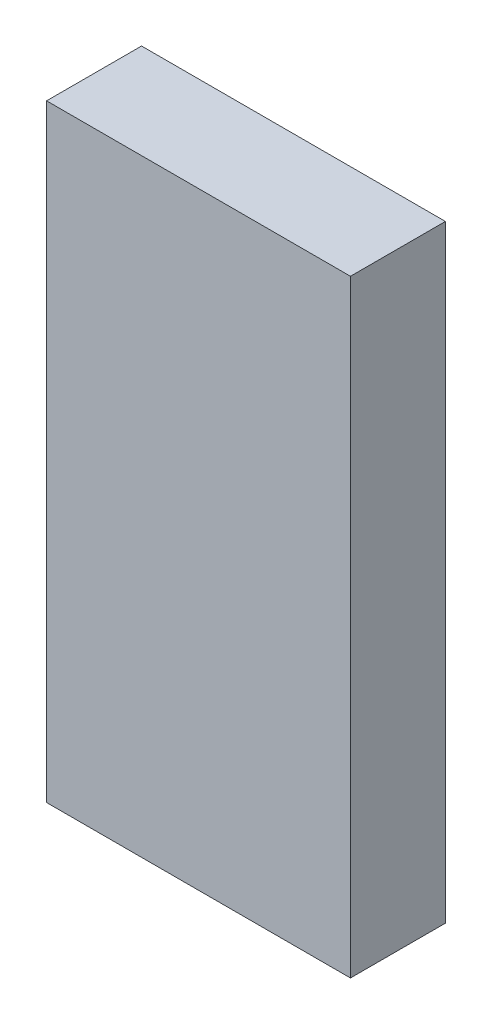
ISO-10303-21;
HEADER;
FILE_DESCRIPTION(('STEP AP214'),'2;1');
FILE_NAME('part.step','',(''),(''),'','','');
FILE_SCHEMA(('AUTOMOTIVE_DESIGN { 1 0 10303 214 1 1 1 1 }'));
ENDSEC;
DATA;
#1=APPLICATION_CONTEXT('core data for automotive mechanical design processes');
#2=APPLICATION_PROTOCOL_DEFINITION('international standard','automotive_design',2000,#1);
#3=PRODUCT_CONTEXT('',#1,'mechanical');
#4=PRODUCT('Part','Part','',(#3));
#5=PRODUCT_RELATED_PRODUCT_CATEGORY('part','',(#4));
#6=PRODUCT_DEFINITION_FORMATION('','',#4);
#7=PRODUCT_DEFINITION_CONTEXT('part definition',#1,'design');
#8=PRODUCT_DEFINITION('design','',#6,#7);
#9=PRODUCT_DEFINITION_SHAPE('','',#8);
#10=(LENGTH_UNIT() NAMED_UNIT(*) SI_UNIT(.MILLI.,.METRE.));
#11=(NAMED_UNIT(*) PLANE_ANGLE_UNIT() SI_UNIT($,.RADIAN.));
#12=(NAMED_UNIT(*) SI_UNIT($,.STERADIAN.) SOLID_ANGLE_UNIT());
#13=UNCERTAINTY_MEASURE_WITH_UNIT(LENGTH_MEASURE(1.E-05),#10,'distance_accuracy_value','');
#14=(GEOMETRIC_REPRESENTATION_CONTEXT(3) GLOBAL_UNCERTAINTY_ASSIGNED_CONTEXT((#13)) GLOBAL_UNIT_ASSIGNED_CONTEXT((#10,
#11,#12)) REPRESENTATION_CONTEXT('',''));
#15=CARTESIAN_POINT('',(0.,0.,0.));
#16=DIRECTION('',(0.,0.,1.));
#17=DIRECTION('',(1.,0.,0.));
#18=AXIS2_PLACEMENT_3D('',#15,#16,#17);
#19=CARTESIAN_POINT('',(0.,0.,31.75));
#20=DIRECTION('',(1.,0.,0.));
#21=DIRECTION('',(0.,0.,-1.));
#22=AXIS2_PLACEMENT_3D('',#19,#20,#21);
#23=PLANE('',#22);
#24=DIRECTION('',(0.,-1.,0.));
#25=VECTOR('',#24,1.);
#26=CARTESIAN_POINT('',(0.,0.,0.));
#27=LINE('',#26,#25);
#28=CARTESIAN_POINT('',(0.,203.2,0.));
#29=VERTEX_POINT('',#28);
#30=CARTESIAN_POINT('',(0.,0.,0.));
#31=VERTEX_POINT('',#30);
#32=EDGE_CURVE('E95',#29,#31,#27,.T.);
#33=ORIENTED_EDGE('',*,*,#32,.T.);
#34=DIRECTION('',(0.,0.,-1.));
#35=VECTOR('',#34,1.);
#36=CARTESIAN_POINT('',(0.,0.,31.75));
#37=LINE('',#36,#35);
#38=CARTESIAN_POINT('',(0.,0.,31.75));
#39=VERTEX_POINT('',#38);
#40=EDGE_CURVE('E11',#39,#31,#37,.T.);
#41=ORIENTED_EDGE('',*,*,#40,.F.);
#42=DIRECTION('',(0.,-1.,0.));
#43=VECTOR('',#42,1.);
#44=CARTESIAN_POINT('',(0.,0.,31.75));
#45=LINE('',#44,#43);
#46=CARTESIAN_POINT('',(0.,203.2,31.75));
#47=VERTEX_POINT('',#46);
#48=EDGE_CURVE('E83',#47,#39,#45,.T.);
#49=ORIENTED_EDGE('',*,*,#48,.F.);
#50=DIRECTION('',(0.,0.,-1.));
#51=VECTOR('',#50,1.);
#52=CARTESIAN_POINT('',(0.,203.2,31.75));
#53=LINE('',#52,#51);
#54=EDGE_CURVE('E91',#47,#29,#53,.T.);
#55=ORIENTED_EDGE('',*,*,#54,.T.);
#56=EDGE_LOOP('',(#33,#41,#49,#55));
#57=FACE_BOUND('',#56,.T.);
#58=ADVANCED_FACE('F32',(#57),#23,.F.);
#59=CARTESIAN_POINT('',(0.,0.,31.75));
#60=DIRECTION('',(0.,1.,0.));
#61=DIRECTION('',(0.,0.,1.));
#62=AXIS2_PLACEMENT_3D('',#59,#60,#61);
#63=PLANE('',#62);
#64=DIRECTION('',(1.,0.,0.));
#65=VECTOR('',#64,1.);
#66=CARTESIAN_POINT('',(0.,0.,0.));
#67=LINE('',#66,#65);
#68=CARTESIAN_POINT('',(101.6,0.,0.));
#69=VERTEX_POINT('',#68);
#70=EDGE_CURVE('E87',#31,#69,#67,.T.);
#71=ORIENTED_EDGE('',*,*,#70,.T.);
#72=DIRECTION('',(0.,0.,-1.));
#73=VECTOR('',#72,1.);
#74=CARTESIAN_POINT('',(101.6,0.,31.75));
#75=LINE('',#74,#73);
#76=CARTESIAN_POINT('',(101.6,0.,31.75));
#77=VERTEX_POINT('',#76);
#78=EDGE_CURVE('E40',#77,#69,#75,.T.);
#79=ORIENTED_EDGE('',*,*,#78,.F.);
#80=DIRECTION('',(1.,0.,0.));
#81=VECTOR('',#80,1.);
#82=CARTESIAN_POINT('',(0.,0.,31.75));
#83=LINE('',#82,#81);
#84=EDGE_CURVE('E78',#39,#77,#83,.T.);
#85=ORIENTED_EDGE('',*,*,#84,.F.);
#86=ORIENTED_EDGE('',*,*,#40,.T.);
#87=EDGE_LOOP('',(#71,#79,#85,#86));
#88=FACE_BOUND('',#87,.T.);
#89=ADVANCED_FACE('F86',(#88),#63,.F.);
#90=CARTESIAN_POINT('',(101.6,0.,31.75));
#91=DIRECTION('',(-1.,0.,0.));
#92=DIRECTION('',(0.,-1.,0.));
#93=AXIS2_PLACEMENT_3D('',#90,#91,#92);
#94=PLANE('',#93);
#95=DIRECTION('',(0.,1.,0.));
#96=VECTOR('',#95,1.);
#97=CARTESIAN_POINT('',(101.6,0.,0.));
#98=LINE('',#97,#96);
#99=CARTESIAN_POINT('',(101.6,203.2,0.));
#100=VERTEX_POINT('',#99);
#101=EDGE_CURVE('E65',#69,#100,#98,.T.);
#102=ORIENTED_EDGE('',*,*,#101,.T.);
#103=DIRECTION('',(0.,0.,-1.));
#104=VECTOR('',#103,1.);
#105=CARTESIAN_POINT('',(101.6,203.2,31.75));
#106=LINE('',#105,#104);
#107=CARTESIAN_POINT('',(101.6,203.2,31.75));
#108=VERTEX_POINT('',#107);
#109=EDGE_CURVE('E88',#108,#100,#106,.T.);
#110=ORIENTED_EDGE('',*,*,#109,.F.);
#111=DIRECTION('',(0.,1.,0.));
#112=VECTOR('',#111,1.);
#113=CARTESIAN_POINT('',(101.6,0.,31.75));
#114=LINE('',#113,#112);
#115=EDGE_CURVE('E81',#77,#108,#114,.T.);
#116=ORIENTED_EDGE('',*,*,#115,.F.);
#117=ORIENTED_EDGE('',*,*,#78,.T.);
#118=EDGE_LOOP('',(#102,#110,#116,#117));
#119=FACE_BOUND('',#118,.T.);
#120=ADVANCED_FACE('F89',(#119),#94,.F.);
#121=CARTESIAN_POINT('',(0.,203.2,31.75));
#122=DIRECTION('',(0.,-1.,0.));
#123=DIRECTION('',(0.,0.,-1.));
#124=AXIS2_PLACEMENT_3D('',#121,#122,#123);
#125=PLANE('',#124);
#126=DIRECTION('',(-1.,0.,0.));
#127=VECTOR('',#126,1.);
#128=CARTESIAN_POINT('',(0.,203.2,0.));
#129=LINE('',#128,#127);
#130=EDGE_CURVE('E71',#100,#29,#129,.T.);
#131=ORIENTED_EDGE('',*,*,#130,.T.);
#132=ORIENTED_EDGE('',*,*,#54,.F.);
#133=DIRECTION('',(-1.,0.,0.));
#134=VECTOR('',#133,1.);
#135=CARTESIAN_POINT('',(0.,203.2,31.75));
#136=LINE('',#135,#134);
#137=EDGE_CURVE('E48',#108,#47,#136,.T.);
#138=ORIENTED_EDGE('',*,*,#137,.F.);
#139=ORIENTED_EDGE('',*,*,#109,.T.);
#140=EDGE_LOOP('',(#131,#132,#138,#139));
#141=FACE_BOUND('',#140,.T.);
#142=ADVANCED_FACE('F102',(#141),#125,.F.);
#143=CARTESIAN_POINT('',(0.,0.,31.75));
#144=DIRECTION('',(0.,0.,-1.));
#145=DIRECTION('',(-1.,0.,0.));
#146=AXIS2_PLACEMENT_3D('',#143,#144,#145);
#147=PLANE('',#146);
#148=ORIENTED_EDGE('',*,*,#48,.T.);
#149=ORIENTED_EDGE('',*,*,#84,.T.);
#150=ORIENTED_EDGE('',*,*,#115,.T.);
#151=ORIENTED_EDGE('',*,*,#137,.T.);
#152=EDGE_LOOP('',(#148,#149,#150,#151));
#153=FACE_BOUND('',#152,.T.);
#154=ADVANCED_FACE('F79',(#153),#147,.F.);
#155=CARTESIAN_POINT('',(0.,0.,0.));
#156=DIRECTION('',(0.,0.,-1.));
#157=DIRECTION('',(-1.,0.,0.));
#158=AXIS2_PLACEMENT_3D('',#155,#156,#157);
#159=PLANE('',#158);
#160=ORIENTED_EDGE('',*,*,#32,.F.);
#161=ORIENTED_EDGE('',*,*,#130,.F.);
#162=ORIENTED_EDGE('',*,*,#101,.F.);
#163=ORIENTED_EDGE('',*,*,#70,.F.);
#164=EDGE_LOOP('',(#160,#161,#162,#163));
#165=FACE_BOUND('',#164,.T.);
#166=ADVANCED_FACE('F105',(#165),#159,.T.);
#167=CLOSED_SHELL('',(#58,#89,#120,#142,#154,#166));
#168=MANIFOLD_SOLID_BREP('B2',#167);
#169=ADVANCED_BREP_SHAPE_REPRESENTATION('',(#18,#168),#14);
#170=SHAPE_DEFINITION_REPRESENTATION(#9,#169);
ENDSEC;
END-ISO-10303-21;
